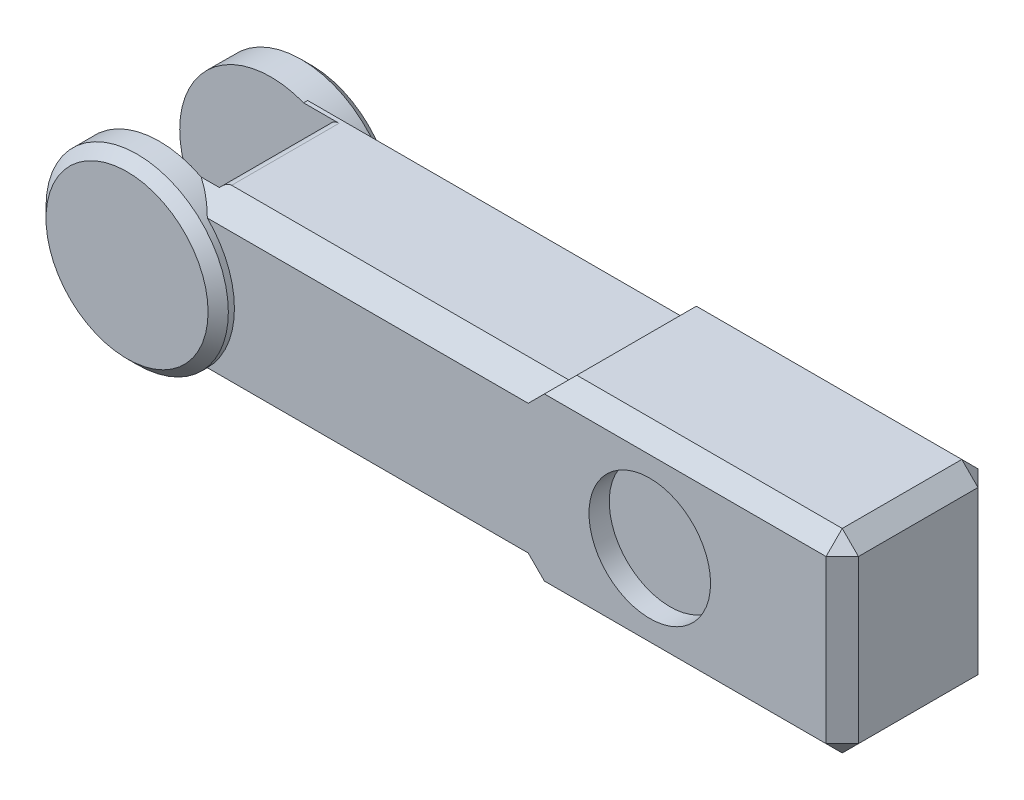
ISO-10303-21;
HEADER;
FILE_DESCRIPTION(('STEP AP214'),'2;1');
FILE_NAME('part.step','',(''),(''),'','','');
FILE_SCHEMA(('AUTOMOTIVE_DESIGN { 1 0 10303 214 1 1 1 1 }'));
ENDSEC;
DATA;
#1=APPLICATION_CONTEXT('core data for automotive mechanical design processes');
#2=APPLICATION_PROTOCOL_DEFINITION('international standard','automotive_design',2000,#1);
#3=PRODUCT_CONTEXT('',#1,'mechanical');
#4=PRODUCT('Part','Part','',(#3));
#5=PRODUCT_RELATED_PRODUCT_CATEGORY('part','',(#4));
#6=PRODUCT_DEFINITION_FORMATION('','',#4);
#7=PRODUCT_DEFINITION_CONTEXT('part definition',#1,'design');
#8=PRODUCT_DEFINITION('design','',#6,#7);
#9=PRODUCT_DEFINITION_SHAPE('','',#8);
#10=(LENGTH_UNIT() NAMED_UNIT(*) SI_UNIT(.MILLI.,.METRE.));
#11=(NAMED_UNIT(*) PLANE_ANGLE_UNIT() SI_UNIT($,.RADIAN.));
#12=(NAMED_UNIT(*) SI_UNIT($,.STERADIAN.) SOLID_ANGLE_UNIT());
#13=UNCERTAINTY_MEASURE_WITH_UNIT(LENGTH_MEASURE(1.E-05),#10,'distance_accuracy_value','');
#14=(GEOMETRIC_REPRESENTATION_CONTEXT(3) GLOBAL_UNCERTAINTY_ASSIGNED_CONTEXT((#13)) GLOBAL_UNIT_ASSIGNED_CONTEXT((#10,
#11,#12)) REPRESENTATION_CONTEXT('',''));
#15=CARTESIAN_POINT('',(0.,0.,0.));
#16=DIRECTION('',(0.,0.,1.));
#17=DIRECTION('',(1.,0.,0.));
#18=AXIS2_PLACEMENT_3D('',#15,#16,#17);
#19=CARTESIAN_POINT('',(-250.,0.,75.));
#20=DIRECTION('',(0.,0.,-1.));
#21=DIRECTION('',(-1.,0.,0.));
#22=AXIS2_PLACEMENT_3D('',#19,#20,#21);
#23=CYLINDRICAL_SURFACE('',#22,45.);
#24=CARTESIAN_POINT('',(-250.,0.,78.));
#25=DIRECTION('',(0.,0.,1.));
#26=DIRECTION('',(1.,0.,0.));
#27=AXIS2_PLACEMENT_3D('',#24,#25,#26);
#28=CIRCLE('',#27,45.);
#29=CARTESIAN_POINT('',(-205.,0.,78.));
#30=VERTEX_POINT('',#29);
#31=EDGE_CURVE('E242',#30,#30,#28,.F.);
#32=ORIENTED_EDGE('',*,*,#31,.T.);
#33=EDGE_LOOP('',(#32));
#34=FACE_BOUND('',#33,.T.);
#35=CARTESIAN_POINT('',(-250.,0.,67.));
#36=DIRECTION('',(0.,0.,-1.));
#37=DIRECTION('',(-1.,0.,0.));
#38=AXIS2_PLACEMENT_3D('',#35,#36,#37);
#39=CIRCLE('',#38,45.);
#40=CARTESIAN_POINT('',(-229.384471871912,-39.9999999999999,67.));
#41=VERTEX_POINT('',#40);
#42=CARTESIAN_POINT('',(-229.384471871912,39.9999999999999,67.));
#43=VERTEX_POINT('',#42);
#44=EDGE_CURVE('E883',#41,#43,#39,.T.);
#45=ORIENTED_EDGE('',*,*,#44,.F.);
#46=CARTESIAN_POINT('',(-250.,0.,107.));
#47=DIRECTION('',(0.,-0.70710678118655,0.707106781186545));
#48=DIRECTION('',(0.,-0.707106781186545,-0.70710678118655));
#49=AXIS2_PLACEMENT_3D('',#46,#47,#48);
#50=ELLIPSE('',#49,63.6396103067895,45.);
#51=CARTESIAN_POINT('',(-218.361415960887,-32.,75.));
#52=VERTEX_POINT('',#51);
#53=EDGE_CURVE('E270',#41,#52,#50,.T.);
#54=ORIENTED_EDGE('',*,*,#53,.T.);
#55=CARTESIAN_POINT('',(-250.,0.,75.));
#56=DIRECTION('',(0.,0.,1.));
#57=DIRECTION('',(1.,0.,0.));
#58=AXIS2_PLACEMENT_3D('',#55,#56,#57);
#59=CIRCLE('',#58,45.);
#60=CARTESIAN_POINT('',(-218.361415960887,32.,75.));
#61=VERTEX_POINT('',#60);
#62=EDGE_CURVE('E243',#52,#61,#59,.T.);
#63=ORIENTED_EDGE('',*,*,#62,.T.);
#64=CARTESIAN_POINT('',(-250.,0.,107.));
#65=DIRECTION('',(0.,0.70710678118655,0.707106781186545));
#66=DIRECTION('',(0.,0.707106781186545,-0.70710678118655));
#67=AXIS2_PLACEMENT_3D('',#64,#65,#66);
#68=ELLIPSE('',#67,63.6396103067895,45.);
#69=EDGE_CURVE('E279',#61,#43,#68,.T.);
#70=ORIENTED_EDGE('',*,*,#69,.T.);
#71=EDGE_LOOP('',(#45,#54,#63,#70));
#72=FACE_BOUND('',#71,.T.);
#73=ADVANCED_FACE('F35',(#34,#72),#23,.T.);
#74=CARTESIAN_POINT('',(-250.,0.,0.));
#75=DIRECTION('',(0.,0.,1.));
#76=DIRECTION('',(1.,0.,0.));
#77=AXIS2_PLACEMENT_3D('',#74,#75,#76);
#78=PLANE('',#77);
#79=DIRECTION('',(0.,-1.,0.));
#80=VECTOR('',#79,1.);
#81=CARTESIAN_POINT('',(87.,0.,0.));
#82=LINE('',#81,#80);
#83=CARTESIAN_POINT('',(87.,40.,0.));
#84=VERTEX_POINT('',#83);
#85=CARTESIAN_POINT('',(87.,-40.,0.));
#86=VERTEX_POINT('',#85);
#87=EDGE_CURVE('E365',#84,#86,#82,.T.);
#88=ORIENTED_EDGE('',*,*,#87,.T.);
#89=DIRECTION('',(-1.,0.,0.));
#90=VECTOR('',#89,1.);
#91=CARTESIAN_POINT('',(-250.,-40.,0.));
#92=LINE('',#91,#90);
#93=CARTESIAN_POINT('',(-51.9999999999998,-40.,0.));
#94=VERTEX_POINT('',#93);
#95=EDGE_CURVE('E367',#86,#94,#92,.T.);
#96=ORIENTED_EDGE('',*,*,#95,.T.);
#97=DIRECTION('',(-0.707106781186549,0.707106781186546,0.));
#98=VECTOR('',#97,1.);
#99=CARTESIAN_POINT('',(-49.9999999999998,-42.,0.));
#100=LINE('',#99,#98);
#101=CARTESIAN_POINT('',(-59.9999999999999,-32.,0.));
#102=VERTEX_POINT('',#101);
#103=EDGE_CURVE('E455',#102,#94,#100,.F.);
#104=ORIENTED_EDGE('',*,*,#103,.F.);
#105=DIRECTION('',(-1.,0.,0.));
#106=VECTOR('',#105,1.);
#107=CARTESIAN_POINT('',(-250.,-31.9999999999999,0.));
#108=LINE('',#107,#106);
#109=CARTESIAN_POINT('',(-218.361415960887,-31.9999999999999,0.));
#110=VERTEX_POINT('',#109);
#111=EDGE_CURVE('E261',#102,#110,#108,.T.);
#112=ORIENTED_EDGE('',*,*,#111,.T.);
#113=CARTESIAN_POINT('',(-250.,0.,0.));
#114=DIRECTION('',(0.,0.,-1.));
#115=DIRECTION('',(-1.,0.,0.));
#116=AXIS2_PLACEMENT_3D('',#113,#114,#115);
#117=CIRCLE('',#116,45.);
#118=CARTESIAN_POINT('',(-218.361415960887,31.9999999999999,0.));
#119=VERTEX_POINT('',#118);
#120=EDGE_CURVE('E251',#119,#110,#117,.T.);
#121=ORIENTED_EDGE('',*,*,#120,.F.);
#122=DIRECTION('',(1.,0.,0.));
#123=VECTOR('',#122,1.);
#124=CARTESIAN_POINT('',(-250.,31.9999999999999,0.));
#125=LINE('',#124,#123);
#126=CARTESIAN_POINT('',(-59.9999999999999,32.,0.));
#127=VERTEX_POINT('',#126);
#128=EDGE_CURVE('E258',#119,#127,#125,.T.);
#129=ORIENTED_EDGE('',*,*,#128,.T.);
#130=DIRECTION('',(0.707106781186549,0.707106781186546,0.));
#131=VECTOR('',#130,1.);
#132=CARTESIAN_POINT('',(-49.9999999999998,42.,0.));
#133=LINE('',#132,#131);
#134=CARTESIAN_POINT('',(-51.9999999999998,40.,0.));
#135=VERTEX_POINT('',#134);
#136=EDGE_CURVE('E448',#135,#127,#133,.F.);
#137=ORIENTED_EDGE('',*,*,#136,.F.);
#138=DIRECTION('',(1.,0.,0.));
#139=VECTOR('',#138,1.);
#140=CARTESIAN_POINT('',(-250.,40.,0.));
#141=LINE('',#140,#139);
#142=EDGE_CURVE('E363',#135,#84,#141,.T.);
#143=ORIENTED_EDGE('',*,*,#142,.T.);
#144=EDGE_LOOP('',(#88,#96,#104,#112,#121,#129,#137,#143));
#145=FACE_BOUND('',#144,.T.);
#146=ADVANCED_FACE('F451',(#145),#78,.F.);
#147=CARTESIAN_POINT('',(95.,48.,75.));
#148=DIRECTION('',(0.,-1.,0.));
#149=DIRECTION('',(1.,0.,0.));
#150=AXIS2_PLACEMENT_3D('',#147,#148,#149);
#151=PLANE('',#150);
#152=DIRECTION('',(0.,0.,-1.));
#153=VECTOR('',#152,1.);
#154=CARTESIAN_POINT('',(87.,48.,75.));
#155=LINE('',#154,#153);
#156=CARTESIAN_POINT('',(87.,48.,67.));
#157=VERTEX_POINT('',#156);
#158=CARTESIAN_POINT('',(87.,48.,7.99999999999995));
#159=VERTEX_POINT('',#158);
#160=EDGE_CURVE('E375',#157,#159,#155,.T.);
#161=ORIENTED_EDGE('',*,*,#160,.T.);
#162=DIRECTION('',(-1.,0.,0.));
#163=VECTOR('',#162,1.);
#164=CARTESIAN_POINT('',(95.,48.,7.99999999999995));
#165=LINE('',#164,#163);
#166=CARTESIAN_POINT('',(-43.9999999999998,48.,7.99999999999995));
#167=VERTEX_POINT('',#166);
#168=EDGE_CURVE('E377',#159,#167,#165,.T.);
#169=ORIENTED_EDGE('',*,*,#168,.T.);
#170=DIRECTION('',(0.,0.,1.));
#171=VECTOR('',#170,1.);
#172=CARTESIAN_POINT('',(-43.9999999999998,48.,75.));
#173=LINE('',#172,#171);
#174=CARTESIAN_POINT('',(-43.9999999999998,48.,67.));
#175=VERTEX_POINT('',#174);
#176=EDGE_CURVE('E449',#175,#167,#173,.F.);
#177=ORIENTED_EDGE('',*,*,#176,.F.);
#178=DIRECTION('',(1.,0.,0.));
#179=VECTOR('',#178,1.);
#180=CARTESIAN_POINT('',(95.,48.,67.));
#181=LINE('',#180,#179);
#182=EDGE_CURVE('E373',#175,#157,#181,.T.);
#183=ORIENTED_EDGE('',*,*,#182,.T.);
#184=EDGE_LOOP('',(#161,#169,#177,#183));
#185=FACE_BOUND('',#184,.T.);
#186=ADVANCED_FACE('F439',(#185),#151,.F.);
#187=CARTESIAN_POINT('',(-49.9999999999998,42.,75.));
#188=DIRECTION('',(-0.707106781186546,0.707106781186549,0.));
#189=DIRECTION('',(-0.707106781186549,-0.707106781186546,0.));
#190=AXIS2_PLACEMENT_3D('',#187,#188,#189);
#191=PLANE('',#190);
#192=ORIENTED_EDGE('',*,*,#176,.T.);
#193=DIRECTION('',(-0.577350269189629,-0.577350269189627,-0.577350269189622));
#194=VECTOR('',#193,1.);
#195=CARTESIAN_POINT('',(2.33333333333391,94.3333333333335,54.3333333333332));
#196=LINE('',#195,#194);
#197=EDGE_CURVE('E381',#167,#135,#196,.T.);
#198=ORIENTED_EDGE('',*,*,#197,.T.);
#199=ORIENTED_EDGE('',*,*,#136,.T.);
#200=DIRECTION('',(0.577350269189628,0.577350269189626,0.577350269189623));
#201=VECTOR('',#200,1.);
#202=CARTESIAN_POINT('',(-28.3333333333331,63.6666666666666,31.6666666666665));
#203=LINE('',#202,#201);
#204=CARTESIAN_POINT('',(-49.9999999999998,42.,10.));
#205=VERTEX_POINT('',#204);
#206=EDGE_CURVE('E278',#127,#205,#203,.T.);
#207=ORIENTED_EDGE('',*,*,#206,.T.);
#208=DIRECTION('',(0.,0.,-1.));
#209=VECTOR('',#208,1.);
#210=CARTESIAN_POINT('',(-49.9999999999998,42.,75.));
#211=LINE('',#210,#209);
#212=CARTESIAN_POINT('',(-49.9999999999998,42.,64.9999999999999));
#213=VERTEX_POINT('',#212);
#214=EDGE_CURVE('E226',#213,#205,#211,.T.);
#215=ORIENTED_EDGE('',*,*,#214,.F.);
#216=DIRECTION('',(0.577350269189626,0.577350269189624,-0.577350269189627));
#217=VECTOR('',#216,1.);
#218=CARTESIAN_POINT('',(-53.3333333333332,38.6666666666667,68.3333333333333));
#219=LINE('',#218,#217);
#220=CARTESIAN_POINT('',(-59.9999999999998,32.,75.));
#221=VERTEX_POINT('',#220);
#222=EDGE_CURVE('E206',#213,#221,#219,.F.);
#223=ORIENTED_EDGE('',*,*,#222,.T.);
#224=DIRECTION('',(0.707106781186549,0.707106781186546,0.));
#225=VECTOR('',#224,1.);
#226=CARTESIAN_POINT('',(-49.9999999999998,42.,75.));
#227=LINE('',#226,#225);
#228=CARTESIAN_POINT('',(-51.9999999999998,40.,75.));
#229=VERTEX_POINT('',#228);
#230=EDGE_CURVE('E292',#229,#221,#227,.F.);
#231=ORIENTED_EDGE('',*,*,#230,.F.);
#232=DIRECTION('',(-0.577350269189626,-0.577350269189624,0.577350269189628));
#233=VECTOR('',#232,1.);
#234=CARTESIAN_POINT('',(-118.,-25.9999999999998,141.));
#235=LINE('',#234,#233);
#236=EDGE_CURVE('E379',#229,#175,#235,.F.);
#237=ORIENTED_EDGE('',*,*,#236,.T.);
#238=EDGE_LOOP('',(#192,#198,#199,#207,#215,#223,#231,#237));
#239=FACE_BOUND('',#238,.T.);
#240=ADVANCED_FACE('F291',(#239),#191,.T.);
#241=CARTESIAN_POINT('',(-49.9999999999998,42.,75.));
#242=DIRECTION('',(0.,-1.,0.));
#243=DIRECTION('',(1.,0.,0.));
#244=AXIS2_PLACEMENT_3D('',#241,#242,#243);
#245=PLANE('',#244);
#246=DIRECTION('',(0.,0.,-1.));
#247=VECTOR('',#246,1.);
#248=CARTESIAN_POINT('',(-233.844505578596,42.,75.));
#249=LINE('',#248,#247);
#250=CARTESIAN_POINT('',(-233.844505578596,42.,12.));
#251=VERTEX_POINT('',#250);
#252=CARTESIAN_POINT('',(-233.844505578596,42.,10.));
#253=VERTEX_POINT('',#252);
#254=EDGE_CURVE('E223',#251,#253,#249,.T.);
#255=ORIENTED_EDGE('',*,*,#254,.F.);
#256=DIRECTION('',(1.,0.,0.));
#257=VECTOR('',#256,1.);
#258=CARTESIAN_POINT('',(-49.9999999999998,42.,12.));
#259=LINE('',#258,#257);
#260=CARTESIAN_POINT('',(-216.3696565584,42.,12.));
#261=VERTEX_POINT('',#260);
#262=EDGE_CURVE('E213',#251,#261,#259,.T.);
#263=ORIENTED_EDGE('',*,*,#262,.T.);
#264=DIRECTION('',(0.,0.,-1.));
#265=VECTOR('',#264,1.);
#266=CARTESIAN_POINT('',(-216.3696565584,42.,75.));
#267=LINE('',#266,#265);
#268=CARTESIAN_POINT('',(-216.3696565584,42.,64.9999999999999));
#269=VERTEX_POINT('',#268);
#270=EDGE_CURVE('E333',#261,#269,#267,.F.);
#271=ORIENTED_EDGE('',*,*,#270,.T.);
#272=DIRECTION('',(1.,0.,0.));
#273=VECTOR('',#272,1.);
#274=CARTESIAN_POINT('',(-49.9999999999998,42.,64.9999999999999));
#275=LINE('',#274,#273);
#276=EDGE_CURVE('E263',#269,#213,#275,.T.);
#277=ORIENTED_EDGE('',*,*,#276,.T.);
#278=ORIENTED_EDGE('',*,*,#214,.T.);
#279=DIRECTION('',(-1.,0.,0.));
#280=VECTOR('',#279,1.);
#281=CARTESIAN_POINT('',(-49.9999999999998,42.,10.));
#282=LINE('',#281,#280);
#283=EDGE_CURVE('E265',#205,#253,#282,.T.);
#284=ORIENTED_EDGE('',*,*,#283,.T.);
#285=EDGE_LOOP('',(#255,#263,#271,#277,#278,#284));
#286=FACE_BOUND('',#285,.T.);
#287=ADVANCED_FACE('F511',(#286),#245,.F.);
#288=CARTESIAN_POINT('',(-250.,0.,-2.99999999999986));
#289=DIRECTION('',(0.,0.,-1.));
#290=DIRECTION('',(-1.,0.,0.));
#291=AXIS2_PLACEMENT_3D('',#288,#289,#290);
#292=CIRCLE('',#291,45.);
#293=CARTESIAN_POINT('',(-295.,0.,-2.99999999999986));
#294=VERTEX_POINT('',#293);
#295=EDGE_CURVE('E303',#294,#294,#292,.F.);
#296=ORIENTED_EDGE('',*,*,#295,.T.);
#297=EDGE_LOOP('',(#296));
#298=FACE_BOUND('',#297,.T.);
#299=DIRECTION('',(0.,0.,-1.));
#300=VECTOR('',#299,1.);
#301=CARTESIAN_POINT('',(-233.844505578596,-42.,75.));
#302=LINE('',#301,#300);
#303=CARTESIAN_POINT('',(-233.844505578597,-42.,12.));
#304=VERTEX_POINT('',#303);
#305=CARTESIAN_POINT('',(-233.844505578596,-42.,10.));
#306=VERTEX_POINT('',#305);
#307=EDGE_CURVE('E201',#304,#306,#302,.T.);
#308=ORIENTED_EDGE('',*,*,#307,.F.);
#309=CARTESIAN_POINT('',(-250.,0.,12.));
#310=DIRECTION('',(0.,0.,-1.));
#311=DIRECTION('',(-1.,0.,0.));
#312=AXIS2_PLACEMENT_3D('',#309,#310,#311);
#313=CIRCLE('',#312,45.);
#314=EDGE_CURVE('E209',#304,#251,#313,.T.);
#315=ORIENTED_EDGE('',*,*,#314,.T.);
#316=ORIENTED_EDGE('',*,*,#254,.T.);
#317=CARTESIAN_POINT('',(-250.,0.,-31.9999999999997));
#318=DIRECTION('',(0.,-0.707106781186546,0.707106781186549));
#319=DIRECTION('',(0.,-0.707106781186549,-0.707106781186546));
#320=AXIS2_PLACEMENT_3D('',#317,#318,#319);
#321=ELLIPSE('',#320,63.6396103067891,45.);
#322=EDGE_CURVE('E276',#253,#119,#321,.F.);
#323=ORIENTED_EDGE('',*,*,#322,.T.);
#324=ORIENTED_EDGE('',*,*,#120,.T.);
#325=CARTESIAN_POINT('',(-250.,0.,-31.9999999999997));
#326=DIRECTION('',(0.,0.707106781186546,0.707106781186549));
#327=DIRECTION('',(0.,0.707106781186549,-0.707106781186546));
#328=AXIS2_PLACEMENT_3D('',#325,#326,#327);
#329=ELLIPSE('',#328,63.6396103067891,45.);
#330=EDGE_CURVE('E221',#110,#306,#329,.F.);
#331=ORIENTED_EDGE('',*,*,#330,.T.);
#332=EDGE_LOOP('',(#308,#315,#316,#323,#324,#331));
#333=FACE_BOUND('',#332,.T.);
#334=ADVANCED_FACE('F218',(#298,#333),#23,.T.);
#335=CARTESIAN_POINT('',(-49.9999999999998,-42.,75.));
#336=DIRECTION('',(0.,1.,0.));
#337=DIRECTION('',(-1.,0.,0.));
#338=AXIS2_PLACEMENT_3D('',#335,#336,#337);
#339=PLANE('',#338);
#340=DIRECTION('',(-1.,0.,0.));
#341=VECTOR('',#340,1.);
#342=CARTESIAN_POINT('',(-233.844505578596,-42.,64.9999999999999));
#343=LINE('',#342,#341);
#344=CARTESIAN_POINT('',(-49.9999999999998,-42.,64.9999999999999));
#345=VERTEX_POINT('',#344);
#346=CARTESIAN_POINT('',(-216.3696565584,-42.,64.9999999999999));
#347=VERTEX_POINT('',#346);
#348=EDGE_CURVE('E256',#345,#347,#343,.T.);
#349=ORIENTED_EDGE('',*,*,#348,.T.);
#350=DIRECTION('',(0.,0.,-1.));
#351=VECTOR('',#350,1.);
#352=CARTESIAN_POINT('',(-216.3696565584,-42.,75.));
#353=LINE('',#352,#351);
#354=CARTESIAN_POINT('',(-216.3696565584,-42.,12.));
#355=VERTEX_POINT('',#354);
#356=EDGE_CURVE('E204',#347,#355,#353,.T.);
#357=ORIENTED_EDGE('',*,*,#356,.T.);
#358=DIRECTION('',(-1.,0.,0.));
#359=VECTOR('',#358,1.);
#360=CARTESIAN_POINT('',(-49.9999999999998,-42.,12.));
#361=LINE('',#360,#359);
#362=EDGE_CURVE('E195',#355,#304,#361,.T.);
#363=ORIENTED_EDGE('',*,*,#362,.T.);
#364=ORIENTED_EDGE('',*,*,#307,.T.);
#365=DIRECTION('',(1.,0.,0.));
#366=VECTOR('',#365,1.);
#367=CARTESIAN_POINT('',(-49.9999999999998,-42.,10.));
#368=LINE('',#367,#366);
#369=CARTESIAN_POINT('',(-49.9999999999998,-42.,10.));
#370=VERTEX_POINT('',#369);
#371=EDGE_CURVE('E306',#306,#370,#368,.T.);
#372=ORIENTED_EDGE('',*,*,#371,.T.);
#373=DIRECTION('',(0.,0.,-1.));
#374=VECTOR('',#373,1.);
#375=CARTESIAN_POINT('',(-49.9999999999998,-42.,75.));
#376=LINE('',#375,#374);
#377=EDGE_CURVE('E224',#345,#370,#376,.T.);
#378=ORIENTED_EDGE('',*,*,#377,.F.);
#379=EDGE_LOOP('',(#349,#357,#363,#364,#372,#378));
#380=FACE_BOUND('',#379,.T.);
#381=ADVANCED_FACE('F198',(#380),#339,.F.);
#382=CARTESIAN_POINT('',(-49.9999999999998,-42.,75.));
#383=DIRECTION('',(-0.707106781186546,-0.707106781186549,0.));
#384=DIRECTION('',(0.707106781186549,-0.707106781186546,0.));
#385=AXIS2_PLACEMENT_3D('',#382,#383,#384);
#386=PLANE('',#385);
#387=ORIENTED_EDGE('',*,*,#103,.T.);
#388=DIRECTION('',(0.577350269189626,-0.577350269189624,0.577350269189628));
#389=VECTOR('',#388,1.);
#390=CARTESIAN_POINT('',(2.33333333333346,-94.3333333333331,54.3333333333334));
#391=LINE('',#390,#389);
#392=CARTESIAN_POINT('',(-43.9999999999998,-48.,8.));
#393=VERTEX_POINT('',#392);
#394=EDGE_CURVE('E371',#94,#393,#391,.T.);
#395=ORIENTED_EDGE('',*,*,#394,.T.);
#396=DIRECTION('',(0.,0.,1.));
#397=VECTOR('',#396,1.);
#398=CARTESIAN_POINT('',(-43.9999999999998,-48.,75.));
#399=LINE('',#398,#397);
#400=CARTESIAN_POINT('',(-43.9999999999998,-48.,67.));
#401=VERTEX_POINT('',#400);
#402=EDGE_CURVE('E229',#401,#393,#399,.F.);
#403=ORIENTED_EDGE('',*,*,#402,.F.);
#404=DIRECTION('',(0.577350269189626,-0.577350269189624,-0.577350269189628));
#405=VECTOR('',#404,1.);
#406=CARTESIAN_POINT('',(-118.,25.9999999999998,141.));
#407=LINE('',#406,#405);
#408=CARTESIAN_POINT('',(-51.9999999999998,-40.,75.));
#409=VERTEX_POINT('',#408);
#410=EDGE_CURVE('E369',#401,#409,#407,.F.);
#411=ORIENTED_EDGE('',*,*,#410,.T.);
#412=DIRECTION('',(-0.707106781186549,0.707106781186546,0.));
#413=VECTOR('',#412,1.);
#414=CARTESIAN_POINT('',(-49.9999999999998,-42.,75.));
#415=LINE('',#414,#413);
#416=CARTESIAN_POINT('',(-59.9999999999998,-32.,75.));
#417=VERTEX_POINT('',#416);
#418=EDGE_CURVE('E464',#417,#409,#415,.F.);
#419=ORIENTED_EDGE('',*,*,#418,.F.);
#420=DIRECTION('',(-0.577350269189626,0.577350269189624,0.577350269189627));
#421=VECTOR('',#420,1.);
#422=CARTESIAN_POINT('',(-53.3333333333332,-38.6666666666667,68.3333333333333));
#423=LINE('',#422,#421);
#424=EDGE_CURVE('E268',#417,#345,#423,.F.);
#425=ORIENTED_EDGE('',*,*,#424,.T.);
#426=ORIENTED_EDGE('',*,*,#377,.T.);
#427=DIRECTION('',(-0.577350269189628,0.577350269189626,-0.577350269189623));
#428=VECTOR('',#427,1.);
#429=CARTESIAN_POINT('',(-28.3333333333331,-63.6666666666666,31.6666666666665));
#430=LINE('',#429,#428);
#431=EDGE_CURVE('E272',#370,#102,#430,.T.);
#432=ORIENTED_EDGE('',*,*,#431,.T.);
#433=EDGE_LOOP('',(#387,#395,#403,#411,#419,#425,#426,#432));
#434=FACE_BOUND('',#433,.T.);
#435=ADVANCED_FACE('F517',(#434),#386,.T.);
#436=CARTESIAN_POINT('',(95.,-48.,75.));
#437=DIRECTION('',(0.,1.,0.));
#438=DIRECTION('',(-1.,0.,0.));
#439=AXIS2_PLACEMENT_3D('',#436,#437,#438);
#440=PLANE('',#439);
#441=ORIENTED_EDGE('',*,*,#402,.T.);
#442=DIRECTION('',(1.,0.,0.));
#443=VECTOR('',#442,1.);
#444=CARTESIAN_POINT('',(95.,-48.,8.00000000000001));
#445=LINE('',#444,#443);
#446=CARTESIAN_POINT('',(87.,-48.,8.00000000000001));
#447=VERTEX_POINT('',#446);
#448=EDGE_CURVE('E361',#393,#447,#445,.T.);
#449=ORIENTED_EDGE('',*,*,#448,.T.);
#450=DIRECTION('',(0.,0.,1.));
#451=VECTOR('',#450,1.);
#452=CARTESIAN_POINT('',(87.,-48.,75.));
#453=LINE('',#452,#451);
#454=CARTESIAN_POINT('',(87.,-48.,67.));
#455=VERTEX_POINT('',#454);
#456=EDGE_CURVE('E358',#447,#455,#453,.T.);
#457=ORIENTED_EDGE('',*,*,#456,.T.);
#458=DIRECTION('',(-1.,0.,0.));
#459=VECTOR('',#458,1.);
#460=CARTESIAN_POINT('',(-43.9999999999998,-48.,67.));
#461=LINE('',#460,#459);
#462=EDGE_CURVE('E356',#455,#401,#461,.T.);
#463=ORIENTED_EDGE('',*,*,#462,.T.);
#464=EDGE_LOOP('',(#441,#449,#457,#463));
#465=FACE_BOUND('',#464,.T.);
#466=ADVANCED_FACE('F470',(#465),#440,.F.);
#467=CARTESIAN_POINT('',(95.,-48.,75.));
#468=DIRECTION('',(-1.,0.,0.));
#469=DIRECTION('',(0.,0.,1.));
#470=AXIS2_PLACEMENT_3D('',#467,#468,#469);
#471=PLANE('',#470);
#472=DIRECTION('',(0.,-1.,0.));
#473=VECTOR('',#472,1.);
#474=CARTESIAN_POINT('',(95.,-48.,67.));
#475=LINE('',#474,#473);
#476=CARTESIAN_POINT('',(95.,40.,67.));
#477=VERTEX_POINT('',#476);
#478=CARTESIAN_POINT('',(95.,-40.,67.));
#479=VERTEX_POINT('',#478);
#480=EDGE_CURVE('E347',#477,#479,#475,.T.);
#481=ORIENTED_EDGE('',*,*,#480,.T.);
#482=DIRECTION('',(0.,0.,-1.));
#483=VECTOR('',#482,1.);
#484=CARTESIAN_POINT('',(95.,-40.,75.));
#485=LINE('',#484,#483);
#486=CARTESIAN_POINT('',(95.,-40.,7.99999999999995));
#487=VERTEX_POINT('',#486);
#488=EDGE_CURVE('E353',#479,#487,#485,.T.);
#489=ORIENTED_EDGE('',*,*,#488,.T.);
#490=DIRECTION('',(0.,1.,0.));
#491=VECTOR('',#490,1.);
#492=CARTESIAN_POINT('',(95.,-48.,7.99999999999995));
#493=LINE('',#492,#491);
#494=CARTESIAN_POINT('',(95.,40.,7.99999999999995));
#495=VERTEX_POINT('',#494);
#496=EDGE_CURVE('E351',#487,#495,#493,.T.);
#497=ORIENTED_EDGE('',*,*,#496,.T.);
#498=DIRECTION('',(0.,0.,1.));
#499=VECTOR('',#498,1.);
#500=CARTESIAN_POINT('',(95.,40.,75.));
#501=LINE('',#500,#499);
#502=EDGE_CURVE('E349',#495,#477,#501,.T.);
#503=ORIENTED_EDGE('',*,*,#502,.T.);
#504=EDGE_LOOP('',(#481,#489,#497,#503));
#505=FACE_BOUND('',#504,.T.);
#506=ADVANCED_FACE('F429',(#505),#471,.F.);
#507=CARTESIAN_POINT('',(-250.,0.,75.));
#508=DIRECTION('',(0.,0.,1.));
#509=DIRECTION('',(1.,0.,0.));
#510=AXIS2_PLACEMENT_3D('',#507,#508,#509);
#511=PLANE('',#510);
#512=DIRECTION('',(0.,1.,0.));
#513=VECTOR('',#512,1.);
#514=CARTESIAN_POINT('',(87.0000000000001,48.,75.));
#515=LINE('',#514,#513);
#516=CARTESIAN_POINT('',(87.0000000000001,-40.,75.));
#517=VERTEX_POINT('',#516);
#518=CARTESIAN_POINT('',(87.0000000000001,40.,75.));
#519=VERTEX_POINT('',#518);
#520=EDGE_CURVE('E44',#517,#519,#515,.T.);
#521=ORIENTED_EDGE('',*,*,#520,.T.);
#522=DIRECTION('',(-1.,0.,0.));
#523=VECTOR('',#522,1.);
#524=CARTESIAN_POINT('',(-43.9999999999998,40.,75.));
#525=LINE('',#524,#523);
#526=EDGE_CURVE('E11',#519,#229,#525,.T.);
#527=ORIENTED_EDGE('',*,*,#526,.T.);
#528=ORIENTED_EDGE('',*,*,#230,.T.);
#529=DIRECTION('',(-1.,0.,0.));
#530=VECTOR('',#529,1.);
#531=CARTESIAN_POINT('',(-233.844505578597,32.,75.));
#532=LINE('',#531,#530);
#533=EDGE_CURVE('E298',#221,#61,#532,.T.);
#534=ORIENTED_EDGE('',*,*,#533,.T.);
#535=ORIENTED_EDGE('',*,*,#62,.F.);
#536=DIRECTION('',(1.,0.,0.));
#537=VECTOR('',#536,1.);
#538=CARTESIAN_POINT('',(-49.9999999999998,-32.,75.));
#539=LINE('',#538,#537);
#540=EDGE_CURVE('E302',#52,#417,#539,.T.);
#541=ORIENTED_EDGE('',*,*,#540,.T.);
#542=ORIENTED_EDGE('',*,*,#418,.T.);
#543=DIRECTION('',(1.,0.,0.));
#544=VECTOR('',#543,1.);
#545=CARTESIAN_POINT('',(95.,-40.,75.));
#546=LINE('',#545,#544);
#547=EDGE_CURVE('E55',#409,#517,#546,.T.);
#548=ORIENTED_EDGE('',*,*,#547,.T.);
#549=EDGE_LOOP('',(#521,#527,#528,#534,#535,#541,#542,#548));
#550=FACE_BOUND('',#549,.T.);
#551=CARTESIAN_POINT('',(0.,0.,75.));
#552=DIRECTION('',(0.,0.,1.));
#553=DIRECTION('',(1.,0.,0.));
#554=AXIS2_PLACEMENT_3D('',#551,#552,#553);
#555=CIRCLE('',#554,30.);
#556=CARTESIAN_POINT('',(30.,0.,75.));
#557=VERTEX_POINT('',#556);
#558=EDGE_CURVE('E254',#557,#557,#555,.T.);
#559=ORIENTED_EDGE('',*,*,#558,.F.);
#560=EDGE_LOOP('',(#559));
#561=FACE_BOUND('',#560,.T.);
#562=ADVANCED_FACE('F553',(#550,#561),#511,.T.);
#563=CARTESIAN_POINT('',(0.,0.,65.));
#564=DIRECTION('',(0.,0.,1.));
#565=DIRECTION('',(1.,0.,0.));
#566=AXIS2_PLACEMENT_3D('',#563,#564,#565);
#567=CYLINDRICAL_SURFACE('',#566,30.);
#568=CARTESIAN_POINT('',(0.,0.,65.));
#569=DIRECTION('',(0.,0.,1.));
#570=DIRECTION('',(1.,0.,0.));
#571=AXIS2_PLACEMENT_3D('',#568,#569,#570);
#572=CIRCLE('',#571,30.);
#573=CARTESIAN_POINT('',(30.,0.,65.));
#574=VERTEX_POINT('',#573);
#575=EDGE_CURVE('E456',#574,#574,#572,.T.);
#576=ORIENTED_EDGE('',*,*,#575,.F.);
#577=EDGE_LOOP('',(#576));
#578=FACE_BOUND('',#577,.T.);
#579=ORIENTED_EDGE('',*,*,#558,.T.);
#580=EDGE_LOOP('',(#579));
#581=FACE_BOUND('',#580,.T.);
#582=ADVANCED_FACE('F549',(#578,#581),#567,.F.);
#583=CARTESIAN_POINT('',(0.,0.,65.));
#584=DIRECTION('',(0.,0.,1.));
#585=DIRECTION('',(1.,0.,0.));
#586=AXIS2_PLACEMENT_3D('',#583,#584,#585);
#587=PLANE('',#586);
#588=ORIENTED_EDGE('',*,*,#575,.T.);
#589=EDGE_LOOP('',(#588));
#590=FACE_BOUND('',#589,.T.);
#591=ADVANCED_FACE('F545',(#590),#587,.T.);
#592=CARTESIAN_POINT('',(-250.,0.,83.));
#593=DIRECTION('',(0.,0.,1.));
#594=DIRECTION('',(1.,0.,0.));
#595=AXIS2_PLACEMENT_3D('',#592,#593,#594);
#596=PLANE('',#595);
#597=CARTESIAN_POINT('',(-250.,0.,83.));
#598=DIRECTION('',(0.,0.,1.));
#599=DIRECTION('',(1.,0.,0.));
#600=AXIS2_PLACEMENT_3D('',#597,#598,#599);
#601=CIRCLE('',#600,39.9999999999999);
#602=CARTESIAN_POINT('',(-210.,0.,83.));
#603=VERTEX_POINT('',#602);
#604=EDGE_CURVE('E239',#603,#603,#601,.T.);
#605=ORIENTED_EDGE('',*,*,#604,.T.);
#606=EDGE_LOOP('',(#605));
#607=FACE_BOUND('',#606,.T.);
#608=ADVANCED_FACE('F536',(#607),#596,.T.);
#609=CARTESIAN_POINT('',(-250.,0.,83.));
#610=DIRECTION('',(0.,0.,-1.));
#611=DIRECTION('',(-1.,0.,0.));
#612=AXIS2_PLACEMENT_3D('',#609,#610,#611);
#613=CONICAL_SURFACE('',#612,39.9999999999999,0.785398163397452);
#614=ORIENTED_EDGE('',*,*,#31,.F.);
#615=EDGE_LOOP('',(#614));
#616=FACE_BOUND('',#615,.T.);
#617=ORIENTED_EDGE('',*,*,#604,.F.);
#618=EDGE_LOOP('',(#617));
#619=FACE_BOUND('',#618,.T.);
#620=ADVANCED_FACE('F531',(#616,#619),#613,.T.);
#621=CARTESIAN_POINT('',(-250.,0.,-8.));
#622=DIRECTION('',(0.,0.,-1.));
#623=DIRECTION('',(-1.,0.,0.));
#624=AXIS2_PLACEMENT_3D('',#621,#622,#623);
#625=PLANE('',#624);
#626=CARTESIAN_POINT('',(-250.,0.,-8.));
#627=DIRECTION('',(0.,0.,-1.));
#628=DIRECTION('',(-1.,0.,0.));
#629=AXIS2_PLACEMENT_3D('',#626,#627,#628);
#630=CIRCLE('',#629,39.9999999999999);
#631=CARTESIAN_POINT('',(-290.,0.,-8.));
#632=VERTEX_POINT('',#631);
#633=EDGE_CURVE('E246',#632,#632,#630,.T.);
#634=ORIENTED_EDGE('',*,*,#633,.T.);
#635=EDGE_LOOP('',(#634));
#636=FACE_BOUND('',#635,.T.);
#637=ADVANCED_FACE('F525',(#636),#625,.T.);
#638=CARTESIAN_POINT('',(-250.,0.,-7.99999999999999));
#639=DIRECTION('',(0.,0.,1.));
#640=DIRECTION('',(1.,0.,0.));
#641=AXIS2_PLACEMENT_3D('',#638,#639,#640);
#642=CONICAL_SURFACE('',#641,39.9999999999999,0.785398163397448);
#643=ORIENTED_EDGE('',*,*,#295,.F.);
#644=EDGE_LOOP('',(#643));
#645=FACE_BOUND('',#644,.T.);
#646=ORIENTED_EDGE('',*,*,#633,.F.);
#647=EDGE_LOOP('',(#646));
#648=FACE_BOUND('',#647,.T.);
#649=ADVANCED_FACE('F521',(#645,#648),#642,.T.);
#650=CARTESIAN_POINT('',(-250.,-32.,75.));
#651=DIRECTION('',(0.,-0.70710678118655,0.707106781186545));
#652=DIRECTION('',(0.,-0.707106781186545,-0.70710678118655));
#653=AXIS2_PLACEMENT_3D('',#650,#651,#652);
#654=PLANE('',#653);
#655=ORIENTED_EDGE('',*,*,#53,.F.);
#656=DIRECTION('',(1.,0.,0.));
#657=VECTOR('',#656,1.);
#658=CARTESIAN_POINT('',(-250.,-39.9999999999999,67.));
#659=LINE('',#658,#657);
#660=CARTESIAN_POINT('',(-220.3696565584,-39.9999999999999,67.));
#661=VERTEX_POINT('',#660);
#662=EDGE_CURVE('E330',#41,#661,#659,.T.);
#663=ORIENTED_EDGE('',*,*,#662,.T.);
#664=CARTESIAN_POINT('',(-216.3696565584,-37.,70.));
#665=DIRECTION('',(0.,-0.70710678118655,0.707106781186545));
#666=DIRECTION('',(0.,-0.707106781186545,-0.70710678118655));
#667=AXIS2_PLACEMENT_3D('',#664,#665,#666);
#668=ELLIPSE('',#667,7.0710678118655,5.);
#669=EDGE_CURVE('E319',#661,#347,#668,.T.);
#670=ORIENTED_EDGE('',*,*,#669,.T.);
#671=ORIENTED_EDGE('',*,*,#348,.F.);
#672=ORIENTED_EDGE('',*,*,#424,.F.);
#673=ORIENTED_EDGE('',*,*,#540,.F.);
#674=EDGE_LOOP('',(#655,#663,#670,#671,#672,#673));
#675=FACE_BOUND('',#674,.T.);
#676=ADVANCED_FACE('F524',(#675),#654,.T.);
#677=CARTESIAN_POINT('',(-49.9999999999998,-42.,10.));
#678=DIRECTION('',(0.,0.707106781186546,0.707106781186549));
#679=DIRECTION('',(0.,-0.707106781186549,0.707106781186546));
#680=AXIS2_PLACEMENT_3D('',#677,#678,#679);
#681=PLANE('',#680);
#682=ORIENTED_EDGE('',*,*,#330,.F.);
#683=ORIENTED_EDGE('',*,*,#111,.F.);
#684=ORIENTED_EDGE('',*,*,#431,.F.);
#685=ORIENTED_EDGE('',*,*,#371,.F.);
#686=EDGE_LOOP('',(#682,#683,#684,#685));
#687=FACE_BOUND('',#686,.T.);
#688=ADVANCED_FACE('F570',(#687),#681,.F.);
#689=CARTESIAN_POINT('',(-49.9999999999998,42.,10.));
#690=DIRECTION('',(0.,-0.707106781186546,0.707106781186549));
#691=DIRECTION('',(0.,-0.707106781186549,-0.707106781186546));
#692=AXIS2_PLACEMENT_3D('',#689,#690,#691);
#693=PLANE('',#692);
#694=ORIENTED_EDGE('',*,*,#206,.F.);
#695=ORIENTED_EDGE('',*,*,#128,.F.);
#696=ORIENTED_EDGE('',*,*,#322,.F.);
#697=ORIENTED_EDGE('',*,*,#283,.F.);
#698=EDGE_LOOP('',(#694,#695,#696,#697));
#699=FACE_BOUND('',#698,.T.);
#700=ADVANCED_FACE('F573',(#699),#693,.F.);
#701=CARTESIAN_POINT('',(-250.,32.,75.));
#702=DIRECTION('',(0.,0.70710678118655,0.707106781186545));
#703=DIRECTION('',(0.,-0.707106781186545,0.70710678118655));
#704=AXIS2_PLACEMENT_3D('',#701,#702,#703);
#705=PLANE('',#704);
#706=CARTESIAN_POINT('',(-216.3696565584,37.,70.));
#707=DIRECTION('',(0.,0.70710678118655,0.707106781186545));
#708=DIRECTION('',(0.,0.707106781186545,-0.70710678118655));
#709=AXIS2_PLACEMENT_3D('',#706,#707,#708);
#710=ELLIPSE('',#709,7.0710678118655,5.);
#711=CARTESIAN_POINT('',(-220.3696565584,39.9999999999999,67.));
#712=VERTEX_POINT('',#711);
#713=EDGE_CURVE('E336',#269,#712,#710,.T.);
#714=ORIENTED_EDGE('',*,*,#713,.T.);
#715=DIRECTION('',(-1.,0.,0.));
#716=VECTOR('',#715,1.);
#717=CARTESIAN_POINT('',(-250.,39.9999999999999,67.));
#718=LINE('',#717,#716);
#719=EDGE_CURVE('E338',#712,#43,#718,.T.);
#720=ORIENTED_EDGE('',*,*,#719,.T.);
#721=ORIENTED_EDGE('',*,*,#69,.F.);
#722=ORIENTED_EDGE('',*,*,#533,.F.);
#723=ORIENTED_EDGE('',*,*,#222,.F.);
#724=ORIENTED_EDGE('',*,*,#276,.F.);
#725=EDGE_LOOP('',(#714,#720,#721,#722,#723,#724));
#726=FACE_BOUND('',#725,.T.);
#727=ADVANCED_FACE('F300',(#726),#705,.T.);
#728=CARTESIAN_POINT('',(-250.,0.,67.));
#729=DIRECTION('',(0.,0.,-1.));
#730=DIRECTION('',(-1.,0.,0.));
#731=AXIS2_PLACEMENT_3D('',#728,#729,#730);
#732=CYLINDRICAL_SURFACE('',#731,45.);
#733=CARTESIAN_POINT('',(-219.73269090256,33.3,12.));
#734=VERTEX_POINT('',#733);
#735=CARTESIAN_POINT('',(-219.73269090256,-33.3,12.));
#736=VERTEX_POINT('',#735);
#737=EDGE_CURVE('E216',#734,#736,#313,.T.);
#738=ORIENTED_EDGE('',*,*,#737,.T.);
#739=DIRECTION('',(0.,0.,-1.));
#740=VECTOR('',#739,1.);
#741=CARTESIAN_POINT('',(-219.73269090256,-33.3,67.));
#742=LINE('',#741,#740);
#743=CARTESIAN_POINT('',(-219.73269090256,-33.3,67.));
#744=VERTEX_POINT('',#743);
#745=EDGE_CURVE('E325',#736,#744,#742,.F.);
#746=ORIENTED_EDGE('',*,*,#745,.T.);
#747=CARTESIAN_POINT('',(-219.73269090256,33.3,67.));
#748=VERTEX_POINT('',#747);
#749=EDGE_CURVE('E255',#748,#744,#39,.T.);
#750=ORIENTED_EDGE('',*,*,#749,.F.);
#751=DIRECTION('',(0.,0.,-1.));
#752=VECTOR('',#751,1.);
#753=CARTESIAN_POINT('',(-219.73269090256,33.3,67.));
#754=LINE('',#753,#752);
#755=EDGE_CURVE('E322',#748,#734,#754,.T.);
#756=ORIENTED_EDGE('',*,*,#755,.T.);
#757=EDGE_LOOP('',(#738,#746,#750,#756));
#758=FACE_BOUND('',#757,.T.);
#759=ADVANCED_FACE('F541',(#758),#732,.F.);
#760=CARTESIAN_POINT('',(-250.,0.,67.));
#761=DIRECTION('',(0.,0.,-1.));
#762=DIRECTION('',(-1.,0.,0.));
#763=AXIS2_PLACEMENT_3D('',#760,#761,#762);
#764=PLANE('',#763);
#765=ORIENTED_EDGE('',*,*,#44,.T.);
#766=ORIENTED_EDGE('',*,*,#719,.F.);
#767=CARTESIAN_POINT('',(-216.3696565584,37.,67.));
#768=DIRECTION('',(0.,0.,-1.));
#769=DIRECTION('',(-1.,0.,0.));
#770=AXIS2_PLACEMENT_3D('',#767,#768,#769);
#771=CIRCLE('',#770,5.);
#772=EDGE_CURVE('E345',#712,#748,#771,.F.);
#773=ORIENTED_EDGE('',*,*,#772,.T.);
#774=ORIENTED_EDGE('',*,*,#749,.T.);
#775=CARTESIAN_POINT('',(-216.3696565584,-37.,67.));
#776=DIRECTION('',(0.,0.,-1.));
#777=DIRECTION('',(-1.,0.,0.));
#778=AXIS2_PLACEMENT_3D('',#775,#776,#777);
#779=CIRCLE('',#778,5.);
#780=EDGE_CURVE('E341',#744,#661,#779,.F.);
#781=ORIENTED_EDGE('',*,*,#780,.T.);
#782=ORIENTED_EDGE('',*,*,#662,.F.);
#783=EDGE_LOOP('',(#765,#766,#773,#774,#781,#782));
#784=FACE_BOUND('',#783,.T.);
#785=ADVANCED_FACE('F687',(#784),#764,.T.);
#786=CARTESIAN_POINT('',(-250.,0.,12.));
#787=DIRECTION('',(0.,0.,-1.));
#788=DIRECTION('',(-1.,0.,0.));
#789=AXIS2_PLACEMENT_3D('',#786,#787,#788);
#790=PLANE('',#789);
#791=ORIENTED_EDGE('',*,*,#737,.F.);
#792=CARTESIAN_POINT('',(-216.3696565584,37.,12.));
#793=DIRECTION('',(0.,0.,-1.));
#794=DIRECTION('',(-1.,0.,0.));
#795=AXIS2_PLACEMENT_3D('',#792,#793,#794);
#796=CIRCLE('',#795,5.);
#797=EDGE_CURVE('E343',#734,#261,#796,.T.);
#798=ORIENTED_EDGE('',*,*,#797,.T.);
#799=ORIENTED_EDGE('',*,*,#262,.F.);
#800=ORIENTED_EDGE('',*,*,#314,.F.);
#801=ORIENTED_EDGE('',*,*,#362,.F.);
#802=CARTESIAN_POINT('',(-216.3696565584,-37.,12.));
#803=DIRECTION('',(0.,0.,-1.));
#804=DIRECTION('',(-1.,0.,0.));
#805=AXIS2_PLACEMENT_3D('',#802,#803,#804);
#806=CIRCLE('',#805,5.);
#807=EDGE_CURVE('E321',#355,#736,#806,.T.);
#808=ORIENTED_EDGE('',*,*,#807,.T.);
#809=EDGE_LOOP('',(#791,#798,#799,#800,#801,#808));
#810=FACE_BOUND('',#809,.T.);
#811=ADVANCED_FACE('F211',(#810),#790,.F.);
#812=CARTESIAN_POINT('',(-216.3696565584,-37.,67.));
#813=DIRECTION('',(0.,0.,-1.));
#814=DIRECTION('',(-1.,0.,0.));
#815=AXIS2_PLACEMENT_3D('',#812,#813,#814);
#816=CYLINDRICAL_SURFACE('',#815,5.);
#817=ORIENTED_EDGE('',*,*,#780,.F.);
#818=ORIENTED_EDGE('',*,*,#745,.F.);
#819=ORIENTED_EDGE('',*,*,#807,.F.);
#820=ORIENTED_EDGE('',*,*,#356,.F.);
#821=ORIENTED_EDGE('',*,*,#669,.F.);
#822=EDGE_LOOP('',(#817,#818,#819,#820,#821));
#823=FACE_BOUND('',#822,.T.);
#824=ADVANCED_FACE('F318',(#823),#816,.T.);
#825=CARTESIAN_POINT('',(-216.3696565584,37.,67.));
#826=DIRECTION('',(0.,0.,-1.));
#827=DIRECTION('',(-1.,0.,0.));
#828=AXIS2_PLACEMENT_3D('',#825,#826,#827);
#829=CYLINDRICAL_SURFACE('',#828,5.);
#830=ORIENTED_EDGE('',*,*,#713,.F.);
#831=ORIENTED_EDGE('',*,*,#270,.F.);
#832=ORIENTED_EDGE('',*,*,#797,.F.);
#833=ORIENTED_EDGE('',*,*,#755,.F.);
#834=ORIENTED_EDGE('',*,*,#772,.F.);
#835=EDGE_LOOP('',(#830,#831,#832,#833,#834));
#836=FACE_BOUND('',#835,.T.);
#837=ADVANCED_FACE('F582',(#836),#829,.T.);
#838=CARTESIAN_POINT('',(-250.,40.,75.));
#839=DIRECTION('',(0.,0.70710678118655,0.707106781186545));
#840=DIRECTION('',(1.,0.,0.));
#841=AXIS2_PLACEMENT_3D('',#838,#839,#840);
#842=PLANE('',#841);
#843=ORIENTED_EDGE('',*,*,#236,.F.);
#844=ORIENTED_EDGE('',*,*,#526,.F.);
#845=DIRECTION('',(0.,-0.707106781186545,0.70710678118655));
#846=VECTOR('',#845,1.);
#847=CARTESIAN_POINT('',(87.0000000000001,44.,71.));
#848=LINE('',#847,#846);
#849=EDGE_CURVE('E39',#157,#519,#848,.T.);
#850=ORIENTED_EDGE('',*,*,#849,.F.);
#851=ORIENTED_EDGE('',*,*,#182,.F.);
#852=EDGE_LOOP('',(#843,#844,#850,#851));
#853=FACE_BOUND('',#852,.T.);
#854=ADVANCED_FACE('F37',(#853),#842,.T.);
#855=CARTESIAN_POINT('',(87.,48.,75.));
#856=DIRECTION('',(-0.70710678118655,-0.707106781186545,0.));
#857=DIRECTION('',(0.,0.,-1.));
#858=AXIS2_PLACEMENT_3D('',#855,#856,#857);
#859=PLANE('',#858);
#860=DIRECTION('',(-0.707106781186545,0.70710678118655,0.));
#861=VECTOR('',#860,1.);
#862=CARTESIAN_POINT('',(95.,40.,7.99999999999995));
#863=LINE('',#862,#861);
#864=EDGE_CURVE('E410',#159,#495,#863,.F.);
#865=ORIENTED_EDGE('',*,*,#864,.F.);
#866=ORIENTED_EDGE('',*,*,#160,.F.);
#867=DIRECTION('',(0.707106781186545,-0.70710678118655,0.));
#868=VECTOR('',#867,1.);
#869=CARTESIAN_POINT('',(95.,40.,67.));
#870=LINE('',#869,#868);
#871=EDGE_CURVE('E412',#477,#157,#870,.F.);
#872=ORIENTED_EDGE('',*,*,#871,.F.);
#873=ORIENTED_EDGE('',*,*,#502,.F.);
#874=EDGE_LOOP('',(#865,#866,#872,#873));
#875=FACE_BOUND('',#874,.T.);
#876=ADVANCED_FACE('F436',(#875),#859,.F.);
#877=CARTESIAN_POINT('',(95.,48.,7.99999999999995));
#878=DIRECTION('',(0.,-0.707106781186545,0.70710678118655));
#879=DIRECTION('',(-1.,0.,0.));
#880=AXIS2_PLACEMENT_3D('',#877,#878,#879);
#881=PLANE('',#880);
#882=ORIENTED_EDGE('',*,*,#197,.F.);
#883=ORIENTED_EDGE('',*,*,#168,.F.);
#884=DIRECTION('',(0.,-0.70710678118655,-0.707106781186545));
#885=VECTOR('',#884,1.);
#886=CARTESIAN_POINT('',(87.,44.,3.99999999999999));
#887=LINE('',#886,#885);
#888=EDGE_CURVE('E407',#84,#159,#887,.F.);
#889=ORIENTED_EDGE('',*,*,#888,.F.);
#890=ORIENTED_EDGE('',*,*,#142,.F.);
#891=EDGE_LOOP('',(#882,#883,#889,#890));
#892=FACE_BOUND('',#891,.T.);
#893=ADVANCED_FACE('F444',(#892),#881,.F.);
#894=CARTESIAN_POINT('',(95.,40.,67.));
#895=DIRECTION('',(0.577350269189631,0.577350269189627,0.57735026918962));
#896=DIRECTION('',(-0.707106781186545,0.70710678118655,0.));
#897=AXIS2_PLACEMENT_3D('',#894,#895,#896);
#898=PLANE('',#897);
#899=ORIENTED_EDGE('',*,*,#871,.T.);
#900=ORIENTED_EDGE('',*,*,#849,.T.);
#901=DIRECTION('',(0.707106781186544,0.,-0.707106781186551));
#902=VECTOR('',#901,1.);
#903=CARTESIAN_POINT('',(95.,40.,67.));
#904=LINE('',#903,#902);
#905=EDGE_CURVE('E404',#477,#519,#904,.F.);
#906=ORIENTED_EDGE('',*,*,#905,.F.);
#907=EDGE_LOOP('',(#899,#900,#906));
#908=FACE_BOUND('',#907,.T.);
#909=ADVANCED_FACE('F419',(#908),#898,.T.);
#910=CARTESIAN_POINT('',(95.,40.,7.99999999999995));
#911=DIRECTION('',(0.577350269189625,0.577350269189621,-0.577350269189631));
#912=DIRECTION('',(-0.707106781186551,0.,-0.707106781186544));
#913=AXIS2_PLACEMENT_3D('',#910,#911,#912);
#914=PLANE('',#913);
#915=ORIENTED_EDGE('',*,*,#888,.T.);
#916=ORIENTED_EDGE('',*,*,#864,.T.);
#917=DIRECTION('',(0.707106781186551,0.,0.707106781186544));
#918=VECTOR('',#917,1.);
#919=CARTESIAN_POINT('',(95.,40.,7.99999999999995));
#920=LINE('',#919,#918);
#921=EDGE_CURVE('E401',#84,#495,#920,.T.);
#922=ORIENTED_EDGE('',*,*,#921,.F.);
#923=EDGE_LOOP('',(#915,#916,#922));
#924=FACE_BOUND('',#923,.T.);
#925=ADVANCED_FACE('F490',(#924),#914,.T.);
#926=CARTESIAN_POINT('',(-250.,-40.,75.));
#927=DIRECTION('',(0.,-0.70710678118655,0.707106781186545));
#928=DIRECTION('',(-1.,0.,0.));
#929=AXIS2_PLACEMENT_3D('',#926,#927,#928);
#930=PLANE('',#929);
#931=ORIENTED_EDGE('',*,*,#410,.F.);
#932=ORIENTED_EDGE('',*,*,#462,.F.);
#933=DIRECTION('',(0.,-0.707106781186545,-0.70710678118655));
#934=VECTOR('',#933,1.);
#935=CARTESIAN_POINT('',(87.,-48.,67.));
#936=LINE('',#935,#934);
#937=EDGE_CURVE('E398',#517,#455,#936,.T.);
#938=ORIENTED_EDGE('',*,*,#937,.F.);
#939=ORIENTED_EDGE('',*,*,#547,.F.);
#940=EDGE_LOOP('',(#931,#932,#938,#939));
#941=FACE_BOUND('',#940,.T.);
#942=ADVANCED_FACE('F492',(#941),#930,.T.);
#943=CARTESIAN_POINT('',(87.0000000000001,0.,75.));
#944=DIRECTION('',(0.707106781186551,0.,0.707106781186544));
#945=DIRECTION('',(0.,-1.,0.));
#946=AXIS2_PLACEMENT_3D('',#943,#944,#945);
#947=PLANE('',#946);
#948=ORIENTED_EDGE('',*,*,#905,.T.);
#949=ORIENTED_EDGE('',*,*,#520,.F.);
#950=DIRECTION('',(-0.707106781186544,0.,0.707106781186551));
#951=VECTOR('',#950,1.);
#952=CARTESIAN_POINT('',(91.,-40.,71.));
#953=LINE('',#952,#951);
#954=EDGE_CURVE('E395',#479,#517,#953,.T.);
#955=ORIENTED_EDGE('',*,*,#954,.F.);
#956=ORIENTED_EDGE('',*,*,#480,.F.);
#957=EDGE_LOOP('',(#948,#949,#955,#956));
#958=FACE_BOUND('',#957,.T.);
#959=ADVANCED_FACE('F424',(#958),#947,.T.);
#960=CARTESIAN_POINT('',(95.,-48.,7.99999999999995));
#961=DIRECTION('',(-0.707106781186544,0.,0.707106781186551));
#962=DIRECTION('',(0.,1.,0.));
#963=AXIS2_PLACEMENT_3D('',#960,#961,#962);
#964=PLANE('',#963);
#965=ORIENTED_EDGE('',*,*,#921,.T.);
#966=ORIENTED_EDGE('',*,*,#496,.F.);
#967=DIRECTION('',(-0.707106781186551,0.,-0.707106781186544));
#968=VECTOR('',#967,1.);
#969=CARTESIAN_POINT('',(95.,-40.,7.99999999999995));
#970=LINE('',#969,#968);
#971=EDGE_CURVE('E392',#86,#487,#970,.F.);
#972=ORIENTED_EDGE('',*,*,#971,.F.);
#973=ORIENTED_EDGE('',*,*,#87,.F.);
#974=EDGE_LOOP('',(#965,#966,#972,#973));
#975=FACE_BOUND('',#974,.T.);
#976=ADVANCED_FACE('F488',(#975),#964,.F.);
#977=CARTESIAN_POINT('',(95.,-48.,8.00000000000001));
#978=DIRECTION('',(0.,0.70710678118655,0.707106781186545));
#979=DIRECTION('',(1.,0.,0.));
#980=AXIS2_PLACEMENT_3D('',#977,#978,#979);
#981=PLANE('',#980);
#982=ORIENTED_EDGE('',*,*,#394,.F.);
#983=ORIENTED_EDGE('',*,*,#95,.F.);
#984=DIRECTION('',(0.,-0.707106781186545,0.70710678118655));
#985=VECTOR('',#984,1.);
#986=CARTESIAN_POINT('',(87.,-44.,4.00000000000002));
#987=LINE('',#986,#985);
#988=EDGE_CURVE('E389',#447,#86,#987,.F.);
#989=ORIENTED_EDGE('',*,*,#988,.F.);
#990=ORIENTED_EDGE('',*,*,#448,.F.);
#991=EDGE_LOOP('',(#982,#983,#989,#990));
#992=FACE_BOUND('',#991,.T.);
#993=ADVANCED_FACE('F477',(#992),#981,.F.);
#994=CARTESIAN_POINT('',(87.,-48.,67.));
#995=DIRECTION('',(0.577350269189626,-0.57735026918963,0.57735026918962));
#996=DIRECTION('',(0.70710678118655,0.707106781186545,0.));
#997=AXIS2_PLACEMENT_3D('',#994,#995,#996);
#998=PLANE('',#997);
#999=ORIENTED_EDGE('',*,*,#954,.T.);
#1000=ORIENTED_EDGE('',*,*,#937,.T.);
#1001=DIRECTION('',(-0.70710678118655,-0.707106781186545,0.));
#1002=VECTOR('',#1001,1.);
#1003=CARTESIAN_POINT('',(87.,-48.,67.));
#1004=LINE('',#1003,#1002);
#1005=EDGE_CURVE('E387',#479,#455,#1004,.T.);
#1006=ORIENTED_EDGE('',*,*,#1005,.F.);
#1007=EDGE_LOOP('',(#999,#1000,#1006));
#1008=FACE_BOUND('',#1007,.T.);
#1009=ADVANCED_FACE('F590',(#1008),#998,.T.);
#1010=CARTESIAN_POINT('',(95.,-40.,7.99999999999995));
#1011=DIRECTION('',(0.577350269189621,-0.577350269189629,-0.577350269189627));
#1012=DIRECTION('',(0.,0.707106781186546,-0.707106781186549));
#1013=AXIS2_PLACEMENT_3D('',#1010,#1011,#1012);
#1014=PLANE('',#1013);
#1015=ORIENTED_EDGE('',*,*,#988,.T.);
#1016=ORIENTED_EDGE('',*,*,#971,.T.);
#1017=DIRECTION('',(0.70710678118655,0.707106781186545,0.));
#1018=VECTOR('',#1017,1.);
#1019=CARTESIAN_POINT('',(95.,-40.,7.99999999999995));
#1020=LINE('',#1019,#1018);
#1021=EDGE_CURVE('E385',#447,#487,#1020,.T.);
#1022=ORIENTED_EDGE('',*,*,#1021,.F.);
#1023=EDGE_LOOP('',(#1015,#1016,#1022));
#1024=FACE_BOUND('',#1023,.T.);
#1025=ADVANCED_FACE('F485',(#1024),#1014,.T.);
#1026=CARTESIAN_POINT('',(95.,-40.,75.));
#1027=DIRECTION('',(-0.707106781186545,0.70710678118655,0.));
#1028=DIRECTION('',(0.,0.,-1.));
#1029=AXIS2_PLACEMENT_3D('',#1026,#1027,#1028);
#1030=PLANE('',#1029);
#1031=ORIENTED_EDGE('',*,*,#1005,.T.);
#1032=ORIENTED_EDGE('',*,*,#456,.F.);
#1033=ORIENTED_EDGE('',*,*,#1021,.T.);
#1034=ORIENTED_EDGE('',*,*,#488,.F.);
#1035=EDGE_LOOP('',(#1031,#1032,#1033,#1034));
#1036=FACE_BOUND('',#1035,.T.);
#1037=ADVANCED_FACE('F484',(#1036),#1030,.F.);
#1038=CLOSED_SHELL('',(#73,#146,#186,#240,#287,#334,#381,#435,#466,#506,#562,#582,#591,#608,
#620,#637,#649,#676,#688,#700,#727,#759,#785,#811,#824,#837,#854,#876,#893,#909,#925,#942,#959,
#976,#993,#1009,#1025,#1037));
#1039=MANIFOLD_SOLID_BREP('B2',#1038);
#1040=ADVANCED_BREP_SHAPE_REPRESENTATION('',(#18,#1039),#14);
#1041=SHAPE_DEFINITION_REPRESENTATION(#9,#1040);
ENDSEC;
END-ISO-10303-21;
